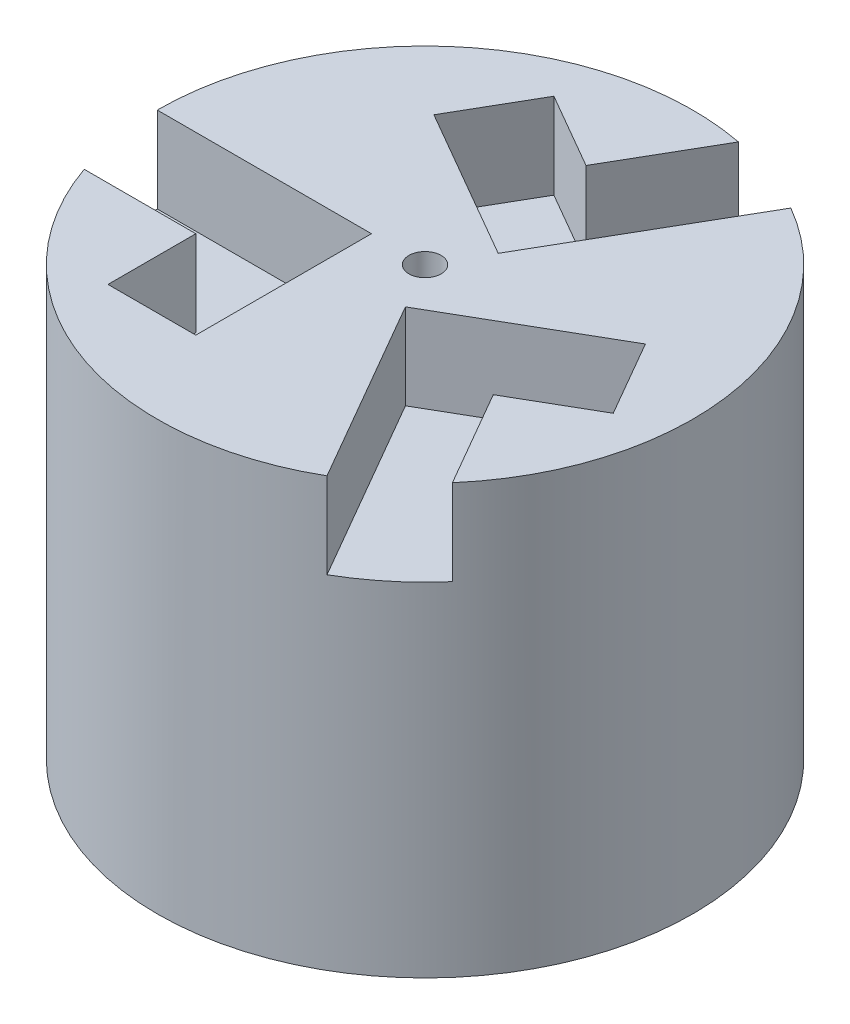
ISO-10303-21;
HEADER;
FILE_DESCRIPTION(('STEP AP214'),'2;1');
FILE_NAME('part.step','',(''),(''),'','','');
FILE_SCHEMA(('AUTOMOTIVE_DESIGN { 1 0 10303 214 1 1 1 1 }'));
ENDSEC;
DATA;
#1=APPLICATION_CONTEXT('core data for automotive mechanical design processes');
#2=APPLICATION_PROTOCOL_DEFINITION('international standard','automotive_design',2000,#1);
#3=PRODUCT_CONTEXT('',#1,'mechanical');
#4=PRODUCT('Part','Part','',(#3));
#5=PRODUCT_RELATED_PRODUCT_CATEGORY('part','',(#4));
#6=PRODUCT_DEFINITION_FORMATION('','',#4);
#7=PRODUCT_DEFINITION_CONTEXT('part definition',#1,'design');
#8=PRODUCT_DEFINITION('design','',#6,#7);
#9=PRODUCT_DEFINITION_SHAPE('','',#8);
#10=(LENGTH_UNIT() NAMED_UNIT(*) SI_UNIT(.MILLI.,.METRE.));
#11=(NAMED_UNIT(*) PLANE_ANGLE_UNIT() SI_UNIT($,.RADIAN.));
#12=(NAMED_UNIT(*) SI_UNIT($,.STERADIAN.) SOLID_ANGLE_UNIT());
#13=UNCERTAINTY_MEASURE_WITH_UNIT(LENGTH_MEASURE(1.E-05),#10,'distance_accuracy_value','');
#14=(GEOMETRIC_REPRESENTATION_CONTEXT(3) GLOBAL_UNCERTAINTY_ASSIGNED_CONTEXT((#13)) GLOBAL_UNIT_ASSIGNED_CONTEXT((#10,
#11,#12)) REPRESENTATION_CONTEXT('',''));
#15=CARTESIAN_POINT('',(0.,0.,0.));
#16=DIRECTION('',(0.,0.,1.));
#17=DIRECTION('',(1.,0.,0.));
#18=AXIS2_PLACEMENT_3D('',#15,#16,#17);
#19=CARTESIAN_POINT('',(0.,40.,0.));
#20=DIRECTION('',(0.,-1.,0.));
#21=DIRECTION('',(0.,0.,-1.));
#22=AXIS2_PLACEMENT_3D('',#19,#20,#21);
#23=CYLINDRICAL_SURFACE('',#22,25.);
#24=CARTESIAN_POINT('',(0.,32.,0.));
#25=DIRECTION('',(0.,1.,0.));
#26=DIRECTION('',(-0.866025403784436,0.,-0.500000000000004));
#27=AXIS2_PLACEMENT_3D('',#24,#25,#26);
#28=CIRCLE('',#27,25.);
#29=CARTESIAN_POINT('',(12.5000000000001,32.,-21.6506350946109));
#30=VERTEX_POINT('',#29);
#31=CARTESIAN_POINT('',(4.70706322426813,32.,-24.5528726588712));
#32=VERTEX_POINT('',#31);
#33=EDGE_CURVE('E173',#30,#32,#28,.T.);
#34=ORIENTED_EDGE('',*,*,#33,.F.);
#35=DIRECTION('',(0.,1.,0.));
#36=VECTOR('',#35,1.);
#37=CARTESIAN_POINT('',(12.5000000000001,32.,-21.6506350946109));
#38=LINE('',#37,#36);
#39=CARTESIAN_POINT('',(12.5000000000001,40.,-21.6506350946109));
#40=VERTEX_POINT('',#39);
#41=EDGE_CURVE('E264',#30,#40,#38,.T.);
#42=ORIENTED_EDGE('',*,*,#41,.T.);
#43=CARTESIAN_POINT('',(0.,40.,0.));
#44=DIRECTION('',(0.,1.,0.));
#45=DIRECTION('',(0.,0.,1.));
#46=AXIS2_PLACEMENT_3D('',#43,#44,#45);
#47=CIRCLE('',#46,25.);
#48=CARTESIAN_POINT('',(18.9098798463327,40.,16.3528726588714));
#49=VERTEX_POINT('',#48);
#50=EDGE_CURVE('E47',#49,#40,#47,.T.);
#51=ORIENTED_EDGE('',*,*,#50,.F.);
#52=DIRECTION('',(0.,1.,0.));
#53=VECTOR('',#52,1.);
#54=CARTESIAN_POINT('',(18.9098798463327,32.,16.3528726588714));
#55=LINE('',#54,#53);
#56=CARTESIAN_POINT('',(18.9098798463327,32.,16.3528726588714));
#57=VERTEX_POINT('',#56);
#58=EDGE_CURVE('E63',#57,#49,#55,.T.);
#59=ORIENTED_EDGE('',*,*,#58,.F.);
#60=CARTESIAN_POINT('',(0.,32.,0.));
#61=DIRECTION('',(0.,1.,0.));
#62=DIRECTION('',(0.866025403784443,0.,-0.499999999999992));
#63=AXIS2_PLACEMENT_3D('',#60,#61,#62);
#64=CIRCLE('',#63,25.);
#65=CARTESIAN_POINT('',(12.4999999999998,32.,21.6506350946111));
#66=VERTEX_POINT('',#65);
#67=EDGE_CURVE('E195',#66,#57,#64,.T.);
#68=ORIENTED_EDGE('',*,*,#67,.F.);
#69=DIRECTION('',(0.,1.,0.));
#70=VECTOR('',#69,1.);
#71=CARTESIAN_POINT('',(12.4999999999998,32.,21.6506350946111));
#72=LINE('',#71,#70);
#73=CARTESIAN_POINT('',(12.4999999999998,40.,21.6506350946111));
#74=VERTEX_POINT('',#73);
#75=EDGE_CURVE('E227',#66,#74,#72,.T.);
#76=ORIENTED_EDGE('',*,*,#75,.T.);
#77=CARTESIAN_POINT('',(-23.6169430706008,40.,8.2));
#78=VERTEX_POINT('',#77);
#79=EDGE_CURVE('E11',#78,#74,#47,.T.);
#80=ORIENTED_EDGE('',*,*,#79,.F.);
#81=DIRECTION('',(0.,1.,0.));
#82=VECTOR('',#81,1.);
#83=CARTESIAN_POINT('',(-23.6169430706008,32.,8.2));
#84=LINE('',#83,#82);
#85=CARTESIAN_POINT('',(-23.6169430706008,32.,8.2));
#86=VERTEX_POINT('',#85);
#87=EDGE_CURVE('E259',#86,#78,#84,.T.);
#88=ORIENTED_EDGE('',*,*,#87,.F.);
#89=CARTESIAN_POINT('',(0.,32.,0.));
#90=DIRECTION('',(0.,1.,0.));
#91=DIRECTION('',(0.,0.,1.));
#92=AXIS2_PLACEMENT_3D('',#89,#90,#91);
#93=CIRCLE('',#92,25.);
#94=CARTESIAN_POINT('',(-25.,32.,0.));
#95=VERTEX_POINT('',#94);
#96=EDGE_CURVE('E240',#95,#86,#93,.T.);
#97=ORIENTED_EDGE('',*,*,#96,.F.);
#98=DIRECTION('',(0.,1.,0.));
#99=VECTOR('',#98,1.);
#100=CARTESIAN_POINT('',(-25.,32.,0.));
#101=LINE('',#100,#99);
#102=CARTESIAN_POINT('',(-25.,40.,0.));
#103=VERTEX_POINT('',#102);
#104=EDGE_CURVE('E275',#95,#103,#101,.T.);
#105=ORIENTED_EDGE('',*,*,#104,.T.);
#106=CARTESIAN_POINT('',(4.70706322426812,40.,-24.5528726588712));
#107=VERTEX_POINT('',#106);
#108=EDGE_CURVE('E48',#107,#103,#47,.T.);
#109=ORIENTED_EDGE('',*,*,#108,.F.);
#110=DIRECTION('',(0.,1.,0.));
#111=VECTOR('',#110,1.);
#112=CARTESIAN_POINT('',(4.70706322426813,32.,-24.5528726588712));
#113=LINE('',#112,#111);
#114=EDGE_CURVE('E55',#32,#107,#113,.T.);
#115=ORIENTED_EDGE('',*,*,#114,.F.);
#116=EDGE_LOOP('',(#34,#42,#51,#59,#68,#76,#80,#88,#97,#105,#109,#115));
#117=FACE_BOUND('',#116,.T.);
#118=CARTESIAN_POINT('',(0.,0.,0.));
#119=DIRECTION('',(0.,1.,0.));
#120=DIRECTION('',(0.,0.,1.));
#121=AXIS2_PLACEMENT_3D('',#118,#119,#120);
#122=CIRCLE('',#121,25.);
#123=CARTESIAN_POINT('',(0.,0.,25.));
#124=VERTEX_POINT('',#123);
#125=EDGE_CURVE('E42',#124,#124,#122,.T.);
#126=ORIENTED_EDGE('',*,*,#125,.T.);
#127=EDGE_LOOP('',(#126));
#128=FACE_BOUND('',#127,.T.);
#129=ADVANCED_FACE('F39',(#117,#128),#23,.T.);
#130=CARTESIAN_POINT('',(0.,40.,0.));
#131=DIRECTION('',(0.,1.,0.));
#132=DIRECTION('',(0.,0.,1.));
#133=AXIS2_PLACEMENT_3D('',#130,#131,#132);
#134=PLANE('',#133);
#135=CARTESIAN_POINT('',(0.,40.,0.));
#136=DIRECTION('',(0.,-1.,0.));
#137=DIRECTION('',(0.,0.,-1.));
#138=AXIS2_PLACEMENT_3D('',#135,#136,#137);
#139=CIRCLE('',#138,1.5);
#140=CARTESIAN_POINT('',(0.,40.,-1.5));
#141=VERTEX_POINT('',#140);
#142=EDGE_CURVE('E548',#141,#141,#139,.T.);
#143=ORIENTED_EDGE('',*,*,#142,.T.);
#144=EDGE_LOOP('',(#143));
#145=FACE_BOUND('',#144,.T.);
#146=DIRECTION('',(0.500000000000004,0.,-0.866025403784436));
#147=VECTOR('',#146,1.);
#148=CARTESIAN_POINT('',(12.5000000000001,40.,-21.6506350946109));
#149=LINE('',#148,#147);
#150=CARTESIAN_POINT('',(2.50000000000002,40.,-4.33012701892218));
#151=VERTEX_POINT('',#150);
#152=EDGE_CURVE('E183',#151,#40,#149,.T.);
#153=ORIENTED_EDGE('',*,*,#152,.F.);
#154=DIRECTION('',(0.866025403784437,0.,0.500000000000004));
#155=VECTOR('',#154,1.);
#156=CARTESIAN_POINT('',(2.50000000000002,40.,-4.33012701892218));
#157=LINE('',#156,#155);
#158=CARTESIAN_POINT('',(-11.7028166220647,40.,-12.5301270189222));
#159=VERTEX_POINT('',#158);
#160=EDGE_CURVE('E572',#159,#151,#157,.T.);
#161=ORIENTED_EDGE('',*,*,#160,.F.);
#162=DIRECTION('',(-0.500000000000004,0.,0.866025403784436));
#163=VECTOR('',#162,1.);
#164=CARTESIAN_POINT('',(-11.7028166220647,40.,-12.5301270189222));
#165=LINE('',#164,#163);
#166=CARTESIAN_POINT('',(-7.6028166220647,40.,-19.6315353299546));
#167=VERTEX_POINT('',#166);
#168=EDGE_CURVE('E569',#167,#159,#165,.T.);
#169=ORIENTED_EDGE('',*,*,#168,.F.);
#170=DIRECTION('',(-0.866025403784436,0.,-0.500000000000004));
#171=VECTOR('',#170,1.);
#172=CARTESIAN_POINT('',(-7.6028166220647,40.,-19.6315353299546));
#173=LINE('',#172,#171);
#174=CARTESIAN_POINT('',(-0.501408311032326,40.,-15.5315353299546));
#175=VERTEX_POINT('',#174);
#176=EDGE_CURVE('E566',#175,#167,#173,.T.);
#177=ORIENTED_EDGE('',*,*,#176,.F.);
#178=DIRECTION('',(-0.500000000000004,0.,0.866025403784437));
#179=VECTOR('',#178,1.);
#180=CARTESIAN_POINT('',(-0.501408311032326,40.,-15.5315353299546));
#181=LINE('',#180,#179);
#182=EDGE_CURVE('E230',#107,#175,#181,.T.);
#183=ORIENTED_EDGE('',*,*,#182,.F.);
#184=ORIENTED_EDGE('',*,*,#108,.T.);
#185=DIRECTION('',(-1.,0.,0.));
#186=VECTOR('',#185,1.);
#187=CARTESIAN_POINT('',(-25.,40.,0.));
#188=LINE('',#187,#186);
#189=CARTESIAN_POINT('',(-5.,40.,0.));
#190=VERTEX_POINT('',#189);
#191=EDGE_CURVE('E244',#190,#103,#188,.T.);
#192=ORIENTED_EDGE('',*,*,#191,.F.);
#193=DIRECTION('',(0.,0.,-1.));
#194=VECTOR('',#193,1.);
#195=CARTESIAN_POINT('',(-5.,40.,0.));
#196=LINE('',#195,#194);
#197=CARTESIAN_POINT('',(-5.,40.,16.4));
#198=VERTEX_POINT('',#197);
#199=EDGE_CURVE('E270',#198,#190,#196,.T.);
#200=ORIENTED_EDGE('',*,*,#199,.F.);
#201=DIRECTION('',(1.,0.,0.));
#202=VECTOR('',#201,1.);
#203=CARTESIAN_POINT('',(-5.,40.,16.4));
#204=LINE('',#203,#202);
#205=CARTESIAN_POINT('',(-13.2,40.,16.4));
#206=VERTEX_POINT('',#205);
#207=EDGE_CURVE('E267',#206,#198,#204,.T.);
#208=ORIENTED_EDGE('',*,*,#207,.F.);
#209=DIRECTION('',(0.,0.,1.));
#210=VECTOR('',#209,1.);
#211=CARTESIAN_POINT('',(-13.2,40.,16.4));
#212=LINE('',#211,#210);
#213=CARTESIAN_POINT('',(-13.2,40.,8.2));
#214=VERTEX_POINT('',#213);
#215=EDGE_CURVE('E263',#214,#206,#212,.T.);
#216=ORIENTED_EDGE('',*,*,#215,.F.);
#217=DIRECTION('',(1.,0.,0.));
#218=VECTOR('',#217,1.);
#219=CARTESIAN_POINT('',(-13.2,40.,8.2));
#220=LINE('',#219,#218);
#221=EDGE_CURVE('E260',#78,#214,#220,.T.);
#222=ORIENTED_EDGE('',*,*,#221,.F.);
#223=ORIENTED_EDGE('',*,*,#79,.T.);
#224=DIRECTION('',(0.499999999999992,0.,0.866025403784443));
#225=VECTOR('',#224,1.);
#226=CARTESIAN_POINT('',(12.4999999999998,40.,21.6506350946111));
#227=LINE('',#226,#225);
#228=CARTESIAN_POINT('',(2.49999999999996,40.,4.33012701892222));
#229=VERTEX_POINT('',#228);
#230=EDGE_CURVE('E199',#229,#74,#227,.T.);
#231=ORIENTED_EDGE('',*,*,#230,.F.);
#232=DIRECTION('',(-0.866025403784443,0.,0.499999999999992));
#233=VECTOR('',#232,1.);
#234=CARTESIAN_POINT('',(2.49999999999996,40.,4.33012701892222));
#235=LINE('',#234,#233);
#236=CARTESIAN_POINT('',(16.7028166220648,40.,-3.86987298107765));
#237=VERTEX_POINT('',#236);
#238=EDGE_CURVE('E223',#237,#229,#235,.T.);
#239=ORIENTED_EDGE('',*,*,#238,.F.);
#240=DIRECTION('',(-0.499999999999992,0.,-0.866025403784443));
#241=VECTOR('',#240,1.);
#242=CARTESIAN_POINT('',(16.7028166220648,40.,-3.86987298107765));
#243=LINE('',#242,#241);
#244=CARTESIAN_POINT('',(20.8028166220648,40.,3.23153532995478));
#245=VERTEX_POINT('',#244);
#246=EDGE_CURVE('E220',#245,#237,#243,.T.);
#247=ORIENTED_EDGE('',*,*,#246,.F.);
#248=DIRECTION('',(0.866025403784443,0.,-0.499999999999992));
#249=VECTOR('',#248,1.);
#250=CARTESIAN_POINT('',(20.8028166220648,40.,3.23153532995478));
#251=LINE('',#250,#249);
#252=CARTESIAN_POINT('',(13.7014083110323,40.,7.33153532995471));
#253=VERTEX_POINT('',#252);
#254=EDGE_CURVE('E216',#253,#245,#251,.T.);
#255=ORIENTED_EDGE('',*,*,#254,.F.);
#256=DIRECTION('',(-0.499999999999992,0.,-0.866025403784443));
#257=VECTOR('',#256,1.);
#258=CARTESIAN_POINT('',(13.7014083110323,40.,7.33153532995471));
#259=LINE('',#258,#257);
#260=EDGE_CURVE('E214',#49,#253,#259,.T.);
#261=ORIENTED_EDGE('',*,*,#260,.F.);
#262=ORIENTED_EDGE('',*,*,#50,.T.);
#263=EDGE_LOOP('',(#153,#161,#169,#177,#183,#184,#192,#200,#208,#216,#222,#223,#231,#239,#247,
#255,#261,#262));
#264=FACE_BOUND('',#263,.T.);
#265=ADVANCED_FACE('F294',(#145,#264),#134,.T.);
#266=CARTESIAN_POINT('',(0.,0.,0.));
#267=DIRECTION('',(0.,1.,0.));
#268=DIRECTION('',(0.,0.,1.));
#269=AXIS2_PLACEMENT_3D('',#266,#267,#268);
#270=PLANE('',#269);
#271=CARTESIAN_POINT('',(0.,0.,0.));
#272=DIRECTION('',(0.,-1.,0.));
#273=DIRECTION('',(0.,0.,-1.));
#274=AXIS2_PLACEMENT_3D('',#271,#272,#273);
#275=CIRCLE('',#274,15.1);
#276=CARTESIAN_POINT('',(0.,0.,-15.1));
#277=VERTEX_POINT('',#276);
#278=EDGE_CURVE('E553',#277,#277,#275,.T.);
#279=ORIENTED_EDGE('',*,*,#278,.F.);
#280=EDGE_LOOP('',(#279));
#281=FACE_BOUND('',#280,.T.);
#282=ORIENTED_EDGE('',*,*,#125,.F.);
#283=EDGE_LOOP('',(#282));
#284=FACE_BOUND('',#283,.T.);
#285=ADVANCED_FACE('F322',(#281,#284),#270,.F.);
#286=CARTESIAN_POINT('',(-25.,32.,0.));
#287=DIRECTION('',(0.,0.,-1.));
#288=DIRECTION('',(-1.,0.,0.));
#289=AXIS2_PLACEMENT_3D('',#286,#287,#288);
#290=PLANE('',#289);
#291=ORIENTED_EDGE('',*,*,#191,.T.);
#292=ORIENTED_EDGE('',*,*,#104,.F.);
#293=DIRECTION('',(-1.,0.,0.));
#294=VECTOR('',#293,1.);
#295=CARTESIAN_POINT('',(-25.,32.,0.));
#296=LINE('',#295,#294);
#297=CARTESIAN_POINT('',(-5.,32.,0.));
#298=VERTEX_POINT('',#297);
#299=EDGE_CURVE('E256',#298,#95,#296,.T.);
#300=ORIENTED_EDGE('',*,*,#299,.F.);
#301=DIRECTION('',(0.,1.,0.));
#302=VECTOR('',#301,1.);
#303=CARTESIAN_POINT('',(-5.,32.,0.));
#304=LINE('',#303,#302);
#305=EDGE_CURVE('E277',#298,#190,#304,.T.);
#306=ORIENTED_EDGE('',*,*,#305,.T.);
#307=EDGE_LOOP('',(#291,#292,#300,#306));
#308=FACE_BOUND('',#307,.T.);
#309=ADVANCED_FACE('F324',(#308),#290,.F.);
#310=CARTESIAN_POINT('',(-5.,32.,0.));
#311=DIRECTION('',(1.,0.,0.));
#312=DIRECTION('',(0.,0.,-1.));
#313=AXIS2_PLACEMENT_3D('',#310,#311,#312);
#314=PLANE('',#313);
#315=ORIENTED_EDGE('',*,*,#199,.T.);
#316=ORIENTED_EDGE('',*,*,#305,.F.);
#317=DIRECTION('',(0.,0.,-1.));
#318=VECTOR('',#317,1.);
#319=CARTESIAN_POINT('',(-5.,32.,0.));
#320=LINE('',#319,#318);
#321=CARTESIAN_POINT('',(-5.,32.,16.4));
#322=VERTEX_POINT('',#321);
#323=EDGE_CURVE('E253',#322,#298,#320,.T.);
#324=ORIENTED_EDGE('',*,*,#323,.F.);
#325=DIRECTION('',(0.,1.,0.));
#326=VECTOR('',#325,1.);
#327=CARTESIAN_POINT('',(-5.,32.,16.4));
#328=LINE('',#327,#326);
#329=EDGE_CURVE('E279',#322,#198,#328,.T.);
#330=ORIENTED_EDGE('',*,*,#329,.T.);
#331=EDGE_LOOP('',(#315,#316,#324,#330));
#332=FACE_BOUND('',#331,.T.);
#333=ADVANCED_FACE('F331',(#332),#314,.F.);
#334=CARTESIAN_POINT('',(-5.,32.,16.4));
#335=DIRECTION('',(0.,0.,1.));
#336=DIRECTION('',(1.,0.,0.));
#337=AXIS2_PLACEMENT_3D('',#334,#335,#336);
#338=PLANE('',#337);
#339=ORIENTED_EDGE('',*,*,#207,.T.);
#340=ORIENTED_EDGE('',*,*,#329,.F.);
#341=DIRECTION('',(1.,0.,0.));
#342=VECTOR('',#341,1.);
#343=CARTESIAN_POINT('',(-5.,32.,16.4));
#344=LINE('',#343,#342);
#345=CARTESIAN_POINT('',(-13.2,32.,16.4));
#346=VERTEX_POINT('',#345);
#347=EDGE_CURVE('E250',#346,#322,#344,.T.);
#348=ORIENTED_EDGE('',*,*,#347,.F.);
#349=DIRECTION('',(0.,1.,0.));
#350=VECTOR('',#349,1.);
#351=CARTESIAN_POINT('',(-13.2,32.,16.4));
#352=LINE('',#351,#350);
#353=EDGE_CURVE('E281',#346,#206,#352,.T.);
#354=ORIENTED_EDGE('',*,*,#353,.T.);
#355=EDGE_LOOP('',(#339,#340,#348,#354));
#356=FACE_BOUND('',#355,.T.);
#357=ADVANCED_FACE('F478',(#356),#338,.F.);
#358=CARTESIAN_POINT('',(-13.2,32.,16.4));
#359=DIRECTION('',(-1.,0.,0.));
#360=DIRECTION('',(0.,0.,1.));
#361=AXIS2_PLACEMENT_3D('',#358,#359,#360);
#362=PLANE('',#361);
#363=ORIENTED_EDGE('',*,*,#215,.T.);
#364=ORIENTED_EDGE('',*,*,#353,.F.);
#365=DIRECTION('',(0.,0.,1.));
#366=VECTOR('',#365,1.);
#367=CARTESIAN_POINT('',(-13.2,32.,16.4));
#368=LINE('',#367,#366);
#369=CARTESIAN_POINT('',(-13.2,32.,8.2));
#370=VERTEX_POINT('',#369);
#371=EDGE_CURVE('E247',#370,#346,#368,.T.);
#372=ORIENTED_EDGE('',*,*,#371,.F.);
#373=DIRECTION('',(0.,1.,0.));
#374=VECTOR('',#373,1.);
#375=CARTESIAN_POINT('',(-13.2,32.,8.2));
#376=LINE('',#375,#374);
#377=EDGE_CURVE('E283',#370,#214,#376,.T.);
#378=ORIENTED_EDGE('',*,*,#377,.T.);
#379=EDGE_LOOP('',(#363,#364,#372,#378));
#380=FACE_BOUND('',#379,.T.);
#381=ADVANCED_FACE('F482',(#380),#362,.F.);
#382=CARTESIAN_POINT('',(-13.2,32.,8.2));
#383=DIRECTION('',(0.,0.,1.));
#384=DIRECTION('',(1.,0.,0.));
#385=AXIS2_PLACEMENT_3D('',#382,#383,#384);
#386=PLANE('',#385);
#387=ORIENTED_EDGE('',*,*,#221,.T.);
#388=ORIENTED_EDGE('',*,*,#377,.F.);
#389=DIRECTION('',(1.,0.,0.));
#390=VECTOR('',#389,1.);
#391=CARTESIAN_POINT('',(-13.2,32.,8.2));
#392=LINE('',#391,#390);
#393=EDGE_CURVE('E243',#86,#370,#392,.T.);
#394=ORIENTED_EDGE('',*,*,#393,.F.);
#395=ORIENTED_EDGE('',*,*,#87,.T.);
#396=EDGE_LOOP('',(#387,#388,#394,#395));
#397=FACE_BOUND('',#396,.T.);
#398=ADVANCED_FACE('F288',(#397),#386,.F.);
#399=CARTESIAN_POINT('',(0.,32.,0.));
#400=DIRECTION('',(0.,1.,0.));
#401=DIRECTION('',(0.,0.,1.));
#402=AXIS2_PLACEMENT_3D('',#399,#400,#401);
#403=PLANE('',#402);
#404=ORIENTED_EDGE('',*,*,#96,.T.);
#405=ORIENTED_EDGE('',*,*,#393,.T.);
#406=ORIENTED_EDGE('',*,*,#371,.T.);
#407=ORIENTED_EDGE('',*,*,#347,.T.);
#408=ORIENTED_EDGE('',*,*,#323,.T.);
#409=ORIENTED_EDGE('',*,*,#299,.T.);
#410=EDGE_LOOP('',(#404,#405,#406,#407,#408,#409));
#411=FACE_BOUND('',#410,.T.);
#412=ADVANCED_FACE('F347',(#411),#403,.T.);
#413=CARTESIAN_POINT('',(12.4999999999998,32.,21.6506350946111));
#414=DIRECTION('',(-0.866025403784443,0.,0.499999999999992));
#415=DIRECTION('',(0.499999999999992,0.,0.866025403784443));
#416=AXIS2_PLACEMENT_3D('',#413,#414,#415);
#417=PLANE('',#416);
#418=ORIENTED_EDGE('',*,*,#230,.T.);
#419=ORIENTED_EDGE('',*,*,#75,.F.);
#420=DIRECTION('',(0.499999999999992,0.,0.866025403784443));
#421=VECTOR('',#420,1.);
#422=CARTESIAN_POINT('',(12.4999999999998,32.,21.6506350946111));
#423=LINE('',#422,#421);
#424=CARTESIAN_POINT('',(2.49999999999996,32.,4.33012701892222));
#425=VERTEX_POINT('',#424);
#426=EDGE_CURVE('E211',#425,#66,#423,.T.);
#427=ORIENTED_EDGE('',*,*,#426,.F.);
#428=DIRECTION('',(0.,1.,0.));
#429=VECTOR('',#428,1.);
#430=CARTESIAN_POINT('',(2.49999999999996,32.,4.33012701892222));
#431=LINE('',#430,#429);
#432=EDGE_CURVE('E231',#425,#229,#431,.T.);
#433=ORIENTED_EDGE('',*,*,#432,.T.);
#434=EDGE_LOOP('',(#418,#419,#427,#433));
#435=FACE_BOUND('',#434,.T.);
#436=ADVANCED_FACE('F300',(#435),#417,.F.);
#437=CARTESIAN_POINT('',(2.49999999999996,32.,4.33012701892222));
#438=DIRECTION('',(-0.499999999999992,0.,-0.866025403784443));
#439=DIRECTION('',(-0.866025403784443,0.,0.499999999999992));
#440=AXIS2_PLACEMENT_3D('',#437,#438,#439);
#441=PLANE('',#440);
#442=ORIENTED_EDGE('',*,*,#238,.T.);
#443=ORIENTED_EDGE('',*,*,#432,.F.);
#444=DIRECTION('',(-0.866025403784443,0.,0.499999999999992));
#445=VECTOR('',#444,1.);
#446=CARTESIAN_POINT('',(2.49999999999996,32.,4.33012701892222));
#447=LINE('',#446,#445);
#448=CARTESIAN_POINT('',(16.7028166220648,32.,-3.86987298107765));
#449=VERTEX_POINT('',#448);
#450=EDGE_CURVE('E208',#449,#425,#447,.T.);
#451=ORIENTED_EDGE('',*,*,#450,.F.);
#452=DIRECTION('',(0.,1.,0.));
#453=VECTOR('',#452,1.);
#454=CARTESIAN_POINT('',(16.7028166220648,32.,-3.86987298107765));
#455=LINE('',#454,#453);
#456=EDGE_CURVE('E233',#449,#237,#455,.T.);
#457=ORIENTED_EDGE('',*,*,#456,.T.);
#458=EDGE_LOOP('',(#442,#443,#451,#457));
#459=FACE_BOUND('',#458,.T.);
#460=ADVANCED_FACE('F306',(#459),#441,.F.);
#461=CARTESIAN_POINT('',(16.7028166220648,32.,-3.86987298107765));
#462=DIRECTION('',(0.866025403784443,0.,-0.499999999999992));
#463=DIRECTION('',(-0.499999999999992,0.,-0.866025403784443));
#464=AXIS2_PLACEMENT_3D('',#461,#462,#463);
#465=PLANE('',#464);
#466=ORIENTED_EDGE('',*,*,#246,.T.);
#467=ORIENTED_EDGE('',*,*,#456,.F.);
#468=DIRECTION('',(-0.499999999999992,0.,-0.866025403784443));
#469=VECTOR('',#468,1.);
#470=CARTESIAN_POINT('',(16.7028166220648,32.,-3.86987298107765));
#471=LINE('',#470,#469);
#472=CARTESIAN_POINT('',(20.8028166220648,32.,3.23153532995478));
#473=VERTEX_POINT('',#472);
#474=EDGE_CURVE('E205',#473,#449,#471,.T.);
#475=ORIENTED_EDGE('',*,*,#474,.F.);
#476=DIRECTION('',(0.,1.,0.));
#477=VECTOR('',#476,1.);
#478=CARTESIAN_POINT('',(20.8028166220648,32.,3.23153532995478));
#479=LINE('',#478,#477);
#480=EDGE_CURVE('E235',#473,#245,#479,.T.);
#481=ORIENTED_EDGE('',*,*,#480,.T.);
#482=EDGE_LOOP('',(#466,#467,#475,#481));
#483=FACE_BOUND('',#482,.T.);
#484=ADVANCED_FACE('F311',(#483),#465,.F.);
#485=CARTESIAN_POINT('',(20.8028166220648,32.,3.23153532995478));
#486=DIRECTION('',(0.499999999999992,0.,0.866025403784443));
#487=DIRECTION('',(0.866025403784443,0.,-0.499999999999992));
#488=AXIS2_PLACEMENT_3D('',#485,#486,#487);
#489=PLANE('',#488);
#490=ORIENTED_EDGE('',*,*,#254,.T.);
#491=ORIENTED_EDGE('',*,*,#480,.F.);
#492=DIRECTION('',(0.866025403784443,0.,-0.499999999999992));
#493=VECTOR('',#492,1.);
#494=CARTESIAN_POINT('',(20.8028166220648,32.,3.23153532995478));
#495=LINE('',#494,#493);
#496=CARTESIAN_POINT('',(13.7014083110323,32.,7.33153532995471));
#497=VERTEX_POINT('',#496);
#498=EDGE_CURVE('E202',#497,#473,#495,.T.);
#499=ORIENTED_EDGE('',*,*,#498,.F.);
#500=DIRECTION('',(0.,1.,0.));
#501=VECTOR('',#500,1.);
#502=CARTESIAN_POINT('',(13.7014083110323,32.,7.33153532995471));
#503=LINE('',#502,#501);
#504=EDGE_CURVE('E237',#497,#253,#503,.T.);
#505=ORIENTED_EDGE('',*,*,#504,.T.);
#506=EDGE_LOOP('',(#490,#491,#499,#505));
#507=FACE_BOUND('',#506,.T.);
#508=ADVANCED_FACE('F314',(#507),#489,.F.);
#509=CARTESIAN_POINT('',(13.7014083110323,32.,7.33153532995471));
#510=DIRECTION('',(0.866025403784443,0.,-0.499999999999992));
#511=DIRECTION('',(-0.499999999999992,0.,-0.866025403784443));
#512=AXIS2_PLACEMENT_3D('',#509,#510,#511);
#513=PLANE('',#512);
#514=ORIENTED_EDGE('',*,*,#260,.T.);
#515=ORIENTED_EDGE('',*,*,#504,.F.);
#516=DIRECTION('',(-0.499999999999992,0.,-0.866025403784443));
#517=VECTOR('',#516,1.);
#518=CARTESIAN_POINT('',(13.7014083110323,32.,7.33153532995471));
#519=LINE('',#518,#517);
#520=EDGE_CURVE('E198',#57,#497,#519,.T.);
#521=ORIENTED_EDGE('',*,*,#520,.F.);
#522=ORIENTED_EDGE('',*,*,#58,.T.);
#523=EDGE_LOOP('',(#514,#515,#521,#522));
#524=FACE_BOUND('',#523,.T.);
#525=ADVANCED_FACE('F315',(#524),#513,.F.);
#526=CARTESIAN_POINT('',(0.,32.,0.));
#527=DIRECTION('',(0.,1.,0.));
#528=DIRECTION('',(0.866025403784443,0.,-0.499999999999992));
#529=AXIS2_PLACEMENT_3D('',#526,#527,#528);
#530=PLANE('',#529);
#531=ORIENTED_EDGE('',*,*,#67,.T.);
#532=ORIENTED_EDGE('',*,*,#520,.T.);
#533=ORIENTED_EDGE('',*,*,#498,.T.);
#534=ORIENTED_EDGE('',*,*,#474,.T.);
#535=ORIENTED_EDGE('',*,*,#450,.T.);
#536=ORIENTED_EDGE('',*,*,#426,.T.);
#537=EDGE_LOOP('',(#531,#532,#533,#534,#535,#536));
#538=FACE_BOUND('',#537,.T.);
#539=ADVANCED_FACE('F302',(#538),#530,.T.);
#540=CARTESIAN_POINT('',(12.5000000000001,32.,-21.6506350946109));
#541=DIRECTION('',(0.866025403784436,0.,0.500000000000004));
#542=DIRECTION('',(0.500000000000004,0.,-0.866025403784436));
#543=AXIS2_PLACEMENT_3D('',#540,#541,#542);
#544=PLANE('',#543);
#545=ORIENTED_EDGE('',*,*,#152,.T.);
#546=ORIENTED_EDGE('',*,*,#41,.F.);
#547=DIRECTION('',(0.500000000000004,0.,-0.866025403784436));
#548=VECTOR('',#547,1.);
#549=CARTESIAN_POINT('',(12.5000000000001,32.,-21.6506350946109));
#550=LINE('',#549,#548);
#551=CARTESIAN_POINT('',(2.50000000000002,32.,-4.33012701892218));
#552=VERTEX_POINT('',#551);
#553=EDGE_CURVE('E180',#552,#30,#550,.T.);
#554=ORIENTED_EDGE('',*,*,#553,.F.);
#555=DIRECTION('',(0.,1.,0.));
#556=VECTOR('',#555,1.);
#557=CARTESIAN_POINT('',(2.50000000000002,32.,-4.33012701892218));
#558=LINE('',#557,#556);
#559=EDGE_CURVE('E577',#552,#151,#558,.T.);
#560=ORIENTED_EDGE('',*,*,#559,.T.);
#561=EDGE_LOOP('',(#545,#546,#554,#560));
#562=FACE_BOUND('',#561,.T.);
#563=ADVANCED_FACE('F389',(#562),#544,.F.);
#564=CARTESIAN_POINT('',(2.50000000000002,32.,-4.33012701892218));
#565=DIRECTION('',(-0.500000000000004,0.,0.866025403784436));
#566=DIRECTION('',(0.866025403784436,0.,0.500000000000004));
#567=AXIS2_PLACEMENT_3D('',#564,#565,#566);
#568=PLANE('',#567);
#569=ORIENTED_EDGE('',*,*,#160,.T.);
#570=ORIENTED_EDGE('',*,*,#559,.F.);
#571=DIRECTION('',(0.866025403784437,0.,0.500000000000004));
#572=VECTOR('',#571,1.);
#573=CARTESIAN_POINT('',(2.50000000000002,32.,-4.33012701892218));
#574=LINE('',#573,#572);
#575=CARTESIAN_POINT('',(-11.7028166220647,32.,-12.5301270189222));
#576=VERTEX_POINT('',#575);
#577=EDGE_CURVE('E191',#576,#552,#574,.T.);
#578=ORIENTED_EDGE('',*,*,#577,.F.);
#579=DIRECTION('',(0.,1.,0.));
#580=VECTOR('',#579,1.);
#581=CARTESIAN_POINT('',(-11.7028166220647,32.,-12.5301270189222));
#582=LINE('',#581,#580);
#583=EDGE_CURVE('E579',#576,#159,#582,.T.);
#584=ORIENTED_EDGE('',*,*,#583,.T.);
#585=EDGE_LOOP('',(#569,#570,#578,#584));
#586=FACE_BOUND('',#585,.T.);
#587=ADVANCED_FACE('F397',(#586),#568,.F.);
#588=CARTESIAN_POINT('',(-11.7028166220647,32.,-12.5301270189222));
#589=DIRECTION('',(-0.866025403784436,0.,-0.500000000000004));
#590=DIRECTION('',(-0.500000000000004,0.,0.866025403784436));
#591=AXIS2_PLACEMENT_3D('',#588,#589,#590);
#592=PLANE('',#591);
#593=ORIENTED_EDGE('',*,*,#168,.T.);
#594=ORIENTED_EDGE('',*,*,#583,.F.);
#595=DIRECTION('',(-0.500000000000004,0.,0.866025403784436));
#596=VECTOR('',#595,1.);
#597=CARTESIAN_POINT('',(-11.7028166220647,32.,-12.5301270189222));
#598=LINE('',#597,#596);
#599=CARTESIAN_POINT('',(-7.6028166220647,32.,-19.6315353299546));
#600=VERTEX_POINT('',#599);
#601=EDGE_CURVE('E561',#600,#576,#598,.T.);
#602=ORIENTED_EDGE('',*,*,#601,.F.);
#603=DIRECTION('',(0.,1.,0.));
#604=VECTOR('',#603,1.);
#605=CARTESIAN_POINT('',(-7.6028166220647,32.,-19.6315353299546));
#606=LINE('',#605,#604);
#607=EDGE_CURVE('E189',#600,#167,#606,.T.);
#608=ORIENTED_EDGE('',*,*,#607,.T.);
#609=EDGE_LOOP('',(#593,#594,#602,#608));
#610=FACE_BOUND('',#609,.T.);
#611=ADVANCED_FACE('F406',(#610),#592,.F.);
#612=CARTESIAN_POINT('',(-7.6028166220647,32.,-19.6315353299546));
#613=DIRECTION('',(0.500000000000004,0.,-0.866025403784436));
#614=DIRECTION('',(-0.866025403784436,0.,-0.500000000000004));
#615=AXIS2_PLACEMENT_3D('',#612,#613,#614);
#616=PLANE('',#615);
#617=ORIENTED_EDGE('',*,*,#176,.T.);
#618=ORIENTED_EDGE('',*,*,#607,.F.);
#619=DIRECTION('',(-0.866025403784436,0.,-0.500000000000004));
#620=VECTOR('',#619,1.);
#621=CARTESIAN_POINT('',(-7.6028166220647,32.,-19.6315353299546));
#622=LINE('',#621,#620);
#623=CARTESIAN_POINT('',(-0.501408311032326,32.,-15.5315353299546));
#624=VERTEX_POINT('',#623);
#625=EDGE_CURVE('E172',#624,#600,#622,.T.);
#626=ORIENTED_EDGE('',*,*,#625,.F.);
#627=DIRECTION('',(0.,1.,0.));
#628=VECTOR('',#627,1.);
#629=CARTESIAN_POINT('',(-0.501408311032326,32.,-15.5315353299546));
#630=LINE('',#629,#628);
#631=EDGE_CURVE('E168',#624,#175,#630,.T.);
#632=ORIENTED_EDGE('',*,*,#631,.T.);
#633=EDGE_LOOP('',(#617,#618,#626,#632));
#634=FACE_BOUND('',#633,.T.);
#635=ADVANCED_FACE('F415',(#634),#616,.F.);
#636=CARTESIAN_POINT('',(-0.501408311032326,32.,-15.5315353299546));
#637=DIRECTION('',(-0.866025403784436,0.,-0.500000000000004));
#638=DIRECTION('',(-0.500000000000004,0.,0.866025403784436));
#639=AXIS2_PLACEMENT_3D('',#636,#637,#638);
#640=PLANE('',#639);
#641=ORIENTED_EDGE('',*,*,#182,.T.);
#642=ORIENTED_EDGE('',*,*,#631,.F.);
#643=DIRECTION('',(-0.500000000000004,0.,0.866025403784437));
#644=VECTOR('',#643,1.);
#645=CARTESIAN_POINT('',(-0.501408311032326,32.,-15.5315353299546));
#646=LINE('',#645,#644);
#647=EDGE_CURVE('E165',#32,#624,#646,.T.);
#648=ORIENTED_EDGE('',*,*,#647,.F.);
#649=ORIENTED_EDGE('',*,*,#114,.T.);
#650=EDGE_LOOP('',(#641,#642,#648,#649));
#651=FACE_BOUND('',#650,.T.);
#652=ADVANCED_FACE('F167',(#651),#640,.F.);
#653=CARTESIAN_POINT('',(0.,32.,0.));
#654=DIRECTION('',(0.,1.,0.));
#655=DIRECTION('',(-0.866025403784436,0.,-0.500000000000004));
#656=AXIS2_PLACEMENT_3D('',#653,#654,#655);
#657=PLANE('',#656);
#658=ORIENTED_EDGE('',*,*,#33,.T.);
#659=ORIENTED_EDGE('',*,*,#647,.T.);
#660=ORIENTED_EDGE('',*,*,#625,.T.);
#661=ORIENTED_EDGE('',*,*,#601,.T.);
#662=ORIENTED_EDGE('',*,*,#577,.T.);
#663=ORIENTED_EDGE('',*,*,#553,.T.);
#664=EDGE_LOOP('',(#658,#659,#660,#661,#662,#663));
#665=FACE_BOUND('',#664,.T.);
#666=ADVANCED_FACE('F177',(#665),#657,.T.);
#667=CARTESIAN_POINT('',(0.,8.7,0.));
#668=DIRECTION('',(0.,-1.,0.));
#669=DIRECTION('',(0.,0.,-1.));
#670=AXIS2_PLACEMENT_3D('',#667,#668,#669);
#671=CYLINDRICAL_SURFACE('',#670,15.1);
#672=CARTESIAN_POINT('',(0.,8.7,0.));
#673=DIRECTION('',(0.,-1.,0.));
#674=DIRECTION('',(0.,0.,-1.));
#675=AXIS2_PLACEMENT_3D('',#672,#673,#674);
#676=CIRCLE('',#675,15.1);
#677=CARTESIAN_POINT('',(0.,8.7,-15.1));
#678=VERTEX_POINT('',#677);
#679=EDGE_CURVE('E217',#678,#678,#676,.T.);
#680=ORIENTED_EDGE('',*,*,#679,.F.);
#681=EDGE_LOOP('',(#680));
#682=FACE_BOUND('',#681,.T.);
#683=ORIENTED_EDGE('',*,*,#278,.T.);
#684=EDGE_LOOP('',(#683));
#685=FACE_BOUND('',#684,.T.);
#686=ADVANCED_FACE('F437',(#682,#685),#671,.F.);
#687=CARTESIAN_POINT('',(0.,8.7,0.));
#688=DIRECTION('',(0.,-1.,0.));
#689=DIRECTION('',(0.,0.,-1.));
#690=AXIS2_PLACEMENT_3D('',#687,#688,#689);
#691=PLANE('',#690);
#692=CARTESIAN_POINT('',(0.,8.7,0.));
#693=DIRECTION('',(0.,-1.,0.));
#694=DIRECTION('',(0.,0.,-1.));
#695=AXIS2_PLACEMENT_3D('',#692,#693,#694);
#696=CIRCLE('',#695,1.5);
#697=CARTESIAN_POINT('',(0.,8.7,-1.5));
#698=VERTEX_POINT('',#697);
#699=EDGE_CURVE('E551',#698,#698,#696,.T.);
#700=ORIENTED_EDGE('',*,*,#699,.F.);
#701=EDGE_LOOP('',(#700));
#702=FACE_BOUND('',#701,.T.);
#703=ORIENTED_EDGE('',*,*,#679,.T.);
#704=EDGE_LOOP('',(#703));
#705=FACE_BOUND('',#704,.T.);
#706=ADVANCED_FACE('F448',(#702,#705),#691,.T.);
#707=CARTESIAN_POINT('',(0.,40.,0.));
#708=DIRECTION('',(0.,-1.,0.));
#709=DIRECTION('',(0.,0.,-1.));
#710=AXIS2_PLACEMENT_3D('',#707,#708,#709);
#711=CYLINDRICAL_SURFACE('',#710,1.5);
#712=ORIENTED_EDGE('',*,*,#142,.F.);
#713=EDGE_LOOP('',(#712));
#714=FACE_BOUND('',#713,.T.);
#715=ORIENTED_EDGE('',*,*,#699,.T.);
#716=EDGE_LOOP('',(#715));
#717=FACE_BOUND('',#716,.T.);
#718=ADVANCED_FACE('F458',(#714,#717),#711,.F.);
#719=CLOSED_SHELL('',(#129,#265,#285,#309,#333,#357,#381,#398,#412,#436,#460,#484,#508,#525,
#539,#563,#587,#611,#635,#652,#666,#686,#706,#718));
#720=MANIFOLD_SOLID_BREP('B2',#719);
#721=ADVANCED_BREP_SHAPE_REPRESENTATION('',(#18,#720),#14);
#722=SHAPE_DEFINITION_REPRESENTATION(#9,#721);
ENDSEC;
END-ISO-10303-21;
